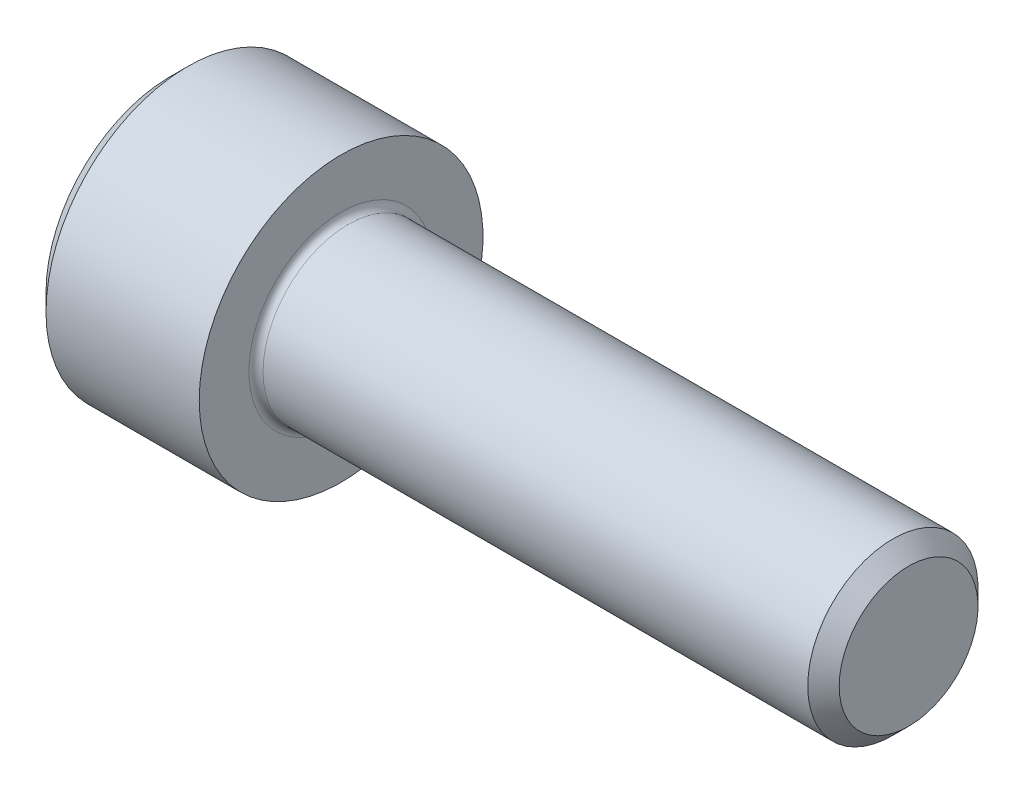
ISO-10303-21;
HEADER;
FILE_DESCRIPTION(('STEP AP214'),'2;1');
FILE_NAME('part.step','',(''),(''),'','','');
FILE_SCHEMA(('AUTOMOTIVE_DESIGN { 1 0 10303 214 1 1 1 1 }'));
ENDSEC;
DATA;
#1=APPLICATION_CONTEXT('core data for automotive mechanical design processes');
#2=APPLICATION_PROTOCOL_DEFINITION('international standard','automotive_design',2000,#1);
#3=PRODUCT_CONTEXT('',#1,'mechanical');
#4=PRODUCT('Part','Part','',(#3));
#5=PRODUCT_RELATED_PRODUCT_CATEGORY('part','',(#4));
#6=PRODUCT_DEFINITION_FORMATION('','',#4);
#7=PRODUCT_DEFINITION_CONTEXT('part definition',#1,'design');
#8=PRODUCT_DEFINITION('design','',#6,#7);
#9=PRODUCT_DEFINITION_SHAPE('','',#8);
#10=(LENGTH_UNIT() NAMED_UNIT(*) SI_UNIT(.MILLI.,.METRE.));
#11=(NAMED_UNIT(*) PLANE_ANGLE_UNIT() SI_UNIT($,.RADIAN.));
#12=(NAMED_UNIT(*) SI_UNIT($,.STERADIAN.) SOLID_ANGLE_UNIT());
#13=UNCERTAINTY_MEASURE_WITH_UNIT(LENGTH_MEASURE(1.E-05),#10,'distance_accuracy_value','');
#14=(GEOMETRIC_REPRESENTATION_CONTEXT(3) GLOBAL_UNCERTAINTY_ASSIGNED_CONTEXT((#13)) GLOBAL_UNIT_ASSIGNED_CONTEXT((#10,
#11,#12)) REPRESENTATION_CONTEXT('',''));
#15=CARTESIAN_POINT('',(0.,0.,0.));
#16=DIRECTION('',(0.,0.,1.));
#17=DIRECTION('',(1.,0.,0.));
#18=AXIS2_PLACEMENT_3D('',#15,#16,#17);
#19=CARTESIAN_POINT('',(0.,0.,0.));
#20=DIRECTION('',(-1.,0.,0.));
#21=DIRECTION('',(0.,0.,1.));
#22=AXIS2_PLACEMENT_3D('',#19,#20,#21);
#23=PLANE('',#22);
#24=DIRECTION('',(0.,-0.499999999999999,0.866025403784439));
#25=VECTOR('',#24,1.);
#26=CARTESIAN_POINT('',(0.,2.93524876856005,0.));
#27=LINE('',#26,#25);
#28=CARTESIAN_POINT('',(0.,2.93524876856005,0.));
#29=VERTEX_POINT('',#28);
#30=CARTESIAN_POINT('',(0.,1.46762438428003,2.542));
#31=VERTEX_POINT('',#30);
#32=EDGE_CURVE('E261',#29,#31,#27,.T.);
#33=ORIENTED_EDGE('',*,*,#32,.T.);
#34=DIRECTION('',(0.,1.,0.));
#35=VECTOR('',#34,1.);
#36=CARTESIAN_POINT('',(0.,-1.46762438428003,2.542));
#37=LINE('',#36,#35);
#38=CARTESIAN_POINT('',(0.,-1.46762438428003,2.542));
#39=VERTEX_POINT('',#38);
#40=EDGE_CURVE('E132',#39,#31,#37,.T.);
#41=ORIENTED_EDGE('',*,*,#40,.F.);
#42=DIRECTION('',(0.,-0.500000000000001,-0.866025403784438));
#43=VECTOR('',#42,1.);
#44=CARTESIAN_POINT('',(0.,-1.46762438428003,2.542));
#45=LINE('',#44,#43);
#46=CARTESIAN_POINT('',(0.,-2.93524876856006,0.));
#47=VERTEX_POINT('',#46);
#48=EDGE_CURVE('E264',#39,#47,#45,.T.);
#49=ORIENTED_EDGE('',*,*,#48,.T.);
#50=DIRECTION('',(0.,0.499999999999999,-0.866025403784439));
#51=VECTOR('',#50,1.);
#52=CARTESIAN_POINT('',(0.,-2.93524876856006,0.));
#53=LINE('',#52,#51);
#54=CARTESIAN_POINT('',(0.,-1.46762438428004,-2.542));
#55=VERTEX_POINT('',#54);
#56=EDGE_CURVE('E267',#47,#55,#53,.T.);
#57=ORIENTED_EDGE('',*,*,#56,.T.);
#58=DIRECTION('',(0.,-1.,0.));
#59=VECTOR('',#58,1.);
#60=CARTESIAN_POINT('',(0.,1.46762438428002,-2.542));
#61=LINE('',#60,#59);
#62=CARTESIAN_POINT('',(0.,1.46762438428002,-2.542));
#63=VERTEX_POINT('',#62);
#64=EDGE_CURVE('E270',#63,#55,#61,.T.);
#65=ORIENTED_EDGE('',*,*,#64,.F.);
#66=DIRECTION('',(0.,-0.500000000000001,-0.866025403784438));
#67=VECTOR('',#66,1.);
#68=CARTESIAN_POINT('',(0.,2.93524876856005,0.));
#69=LINE('',#68,#67);
#70=EDGE_CURVE('E127',#29,#63,#69,.T.);
#71=ORIENTED_EDGE('',*,*,#70,.F.);
#72=EDGE_LOOP('',(#33,#41,#49,#57,#65,#71));
#73=FACE_BOUND('',#72,.T.);
#74=CARTESIAN_POINT('',(0.,0.,0.));
#75=DIRECTION('',(-1.,0.,0.));
#76=DIRECTION('',(0.,0.,1.));
#77=AXIS2_PLACEMENT_3D('',#74,#75,#76);
#78=CIRCLE('',#77,4.4);
#79=CARTESIAN_POINT('',(0.,0.,4.4));
#80=VERTEX_POINT('',#79);
#81=EDGE_CURVE('E156',#80,#80,#78,.T.);
#82=ORIENTED_EDGE('',*,*,#81,.T.);
#83=EDGE_LOOP('',(#82));
#84=FACE_BOUND('',#83,.T.);
#85=ADVANCED_FACE('F36',(#73,#84),#23,.T.);
#86=CARTESIAN_POINT('',(0.,0.,0.));
#87=DIRECTION('',(1.,0.,0.));
#88=DIRECTION('',(0.,0.,-1.));
#89=AXIS2_PLACEMENT_3D('',#86,#87,#88);
#90=CONICAL_SURFACE('',#89,4.4,0.785398163397442);
#91=CARTESIAN_POINT('',(0.600000000000003,0.,0.));
#92=DIRECTION('',(-1.,0.,0.));
#93=DIRECTION('',(0.,0.,1.));
#94=AXIS2_PLACEMENT_3D('',#91,#92,#93);
#95=CIRCLE('',#94,5.);
#96=CARTESIAN_POINT('',(0.600000000000003,0.,5.));
#97=VERTEX_POINT('',#96);
#98=EDGE_CURVE('E153',#97,#97,#95,.T.);
#99=ORIENTED_EDGE('',*,*,#98,.T.);
#100=EDGE_LOOP('',(#99));
#101=FACE_BOUND('',#100,.T.);
#102=ORIENTED_EDGE('',*,*,#81,.F.);
#103=EDGE_LOOP('',(#102));
#104=FACE_BOUND('',#103,.T.);
#105=ADVANCED_FACE('F177',(#101,#104),#90,.T.);
#106=CARTESIAN_POINT('',(-31.75,0.,0.));
#107=DIRECTION('',(-1.,0.,0.));
#108=DIRECTION('',(0.,0.,1.));
#109=AXIS2_PLACEMENT_3D('',#106,#107,#108);
#110=CYLINDRICAL_SURFACE('',#109,5.);
#111=CARTESIAN_POINT('',(6.,0.,0.));
#112=DIRECTION('',(-1.,0.,0.));
#113=DIRECTION('',(0.,0.,1.));
#114=AXIS2_PLACEMENT_3D('',#111,#112,#113);
#115=CIRCLE('',#114,5.);
#116=CARTESIAN_POINT('',(6.,0.,5.));
#117=VERTEX_POINT('',#116);
#118=EDGE_CURVE('E150',#117,#117,#115,.T.);
#119=ORIENTED_EDGE('',*,*,#118,.T.);
#120=EDGE_LOOP('',(#119));
#121=FACE_BOUND('',#120,.T.);
#122=ORIENTED_EDGE('',*,*,#98,.F.);
#123=EDGE_LOOP('',(#122));
#124=FACE_BOUND('',#123,.T.);
#125=ADVANCED_FACE('F182',(#121,#124),#110,.T.);
#126=CARTESIAN_POINT('',(6.,5.,0.));
#127=DIRECTION('',(1.,0.,0.));
#128=DIRECTION('',(0.,0.,-1.));
#129=AXIS2_PLACEMENT_3D('',#126,#127,#128);
#130=PLANE('',#129);
#131=CARTESIAN_POINT('',(6.,0.,0.));
#132=DIRECTION('',(1.,0.,0.));
#133=DIRECTION('',(0.,0.,-1.));
#134=AXIS2_PLACEMENT_3D('',#131,#132,#133);
#135=CIRCLE('',#134,3.24999999999998);
#136=CARTESIAN_POINT('',(6.,0.,-3.24999999999998));
#137=VERTEX_POINT('',#136);
#138=EDGE_CURVE('E44',#137,#137,#135,.F.);
#139=ORIENTED_EDGE('',*,*,#138,.T.);
#140=EDGE_LOOP('',(#139));
#141=FACE_BOUND('',#140,.T.);
#142=ORIENTED_EDGE('',*,*,#118,.F.);
#143=EDGE_LOOP('',(#142));
#144=FACE_BOUND('',#143,.T.);
#145=ADVANCED_FACE('F161',(#141,#144),#130,.T.);
#146=CARTESIAN_POINT('',(-31.75,0.,0.));
#147=DIRECTION('',(-1.,0.,0.));
#148=DIRECTION('',(0.,0.,1.));
#149=AXIS2_PLACEMENT_3D('',#146,#147,#148);
#150=CYLINDRICAL_SURFACE('',#149,2.99999999999998);
#151=CARTESIAN_POINT('',(6.25,0.,0.));
#152=DIRECTION('',(1.,0.,0.));
#153=DIRECTION('',(0.,0.,-1.));
#154=AXIS2_PLACEMENT_3D('',#151,#152,#153);
#155=CIRCLE('',#154,2.99999999999998);
#156=CARTESIAN_POINT('',(6.25,0.,-2.99999999999998));
#157=VERTEX_POINT('',#156);
#158=EDGE_CURVE('E11',#157,#157,#155,.T.);
#159=ORIENTED_EDGE('',*,*,#158,.T.);
#160=EDGE_LOOP('',(#159));
#161=FACE_BOUND('',#160,.T.);
#162=CARTESIAN_POINT('',(25.4455,0.,0.));
#163=DIRECTION('',(-1.,0.,0.));
#164=DIRECTION('',(0.,0.,1.));
#165=AXIS2_PLACEMENT_3D('',#162,#163,#164);
#166=CIRCLE('',#165,2.99999999999995);
#167=CARTESIAN_POINT('',(25.4455,0.,2.99999999999995));
#168=VERTEX_POINT('',#167);
#169=EDGE_CURVE('E147',#168,#168,#166,.T.);
#170=ORIENTED_EDGE('',*,*,#169,.T.);
#171=EDGE_LOOP('',(#170));
#172=FACE_BOUND('',#171,.T.);
#173=ADVANCED_FACE('F192',(#161,#172),#150,.T.);
#174=CARTESIAN_POINT('',(26.,0.,0.));
#175=DIRECTION('',(-1.,0.,0.));
#176=DIRECTION('',(0.,0.,1.));
#177=AXIS2_PLACEMENT_3D('',#174,#175,#176);
#178=CONICAL_SURFACE('',#177,2.4455,0.785398163397388);
#179=ORIENTED_EDGE('',*,*,#169,.F.);
#180=EDGE_LOOP('',(#179));
#181=FACE_BOUND('',#180,.T.);
#182=CARTESIAN_POINT('',(26.,0.,0.));
#183=DIRECTION('',(-1.,0.,0.));
#184=DIRECTION('',(0.,0.,1.));
#185=AXIS2_PLACEMENT_3D('',#182,#183,#184);
#186=CIRCLE('',#185,2.4455);
#187=CARTESIAN_POINT('',(26.,0.,2.4455));
#188=VERTEX_POINT('',#187);
#189=EDGE_CURVE('E143',#188,#188,#186,.T.);
#190=ORIENTED_EDGE('',*,*,#189,.T.);
#191=EDGE_LOOP('',(#190));
#192=FACE_BOUND('',#191,.T.);
#193=ADVANCED_FACE('F172',(#181,#192),#178,.T.);
#194=CARTESIAN_POINT('',(26.,2.4455,0.));
#195=DIRECTION('',(1.,0.,0.));
#196=DIRECTION('',(0.,0.,-1.));
#197=AXIS2_PLACEMENT_3D('',#194,#195,#196);
#198=PLANE('',#197);
#199=ORIENTED_EDGE('',*,*,#189,.F.);
#200=EDGE_LOOP('',(#199));
#201=FACE_BOUND('',#200,.T.);
#202=ADVANCED_FACE('F165',(#201),#198,.T.);
#203=CARTESIAN_POINT('',(6.25,0.,0.));
#204=DIRECTION('',(1.,0.,0.));
#205=DIRECTION('',(0.,0.,-1.));
#206=AXIS2_PLACEMENT_3D('',#203,#204,#205);
#207=TOROIDAL_SURFACE('',#206,3.24999999999998,0.25);
#208=ORIENTED_EDGE('',*,*,#158,.F.);
#209=EDGE_LOOP('',(#208));
#210=FACE_BOUND('',#209,.T.);
#211=ORIENTED_EDGE('',*,*,#138,.F.);
#212=EDGE_LOOP('',(#211));
#213=FACE_BOUND('',#212,.T.);
#214=ADVANCED_FACE('F38',(#210,#213),#207,.F.);
#215=CARTESIAN_POINT('',(3.,2.93524876856005,0.));
#216=DIRECTION('',(0.,-0.866025403784439,-0.499999999999999));
#217=DIRECTION('',(0.,0.499999999999999,-0.866025403784439));
#218=AXIS2_PLACEMENT_3D('',#215,#216,#217);
#219=PLANE('',#218);
#220=ORIENTED_EDGE('',*,*,#32,.F.);
#221=DIRECTION('',(-1.,0.,0.));
#222=VECTOR('',#221,1.);
#223=CARTESIAN_POINT('',(3.,2.93524876856005,0.));
#224=LINE('',#223,#222);
#225=CARTESIAN_POINT('',(3.,2.93524876856005,0.));
#226=VERTEX_POINT('',#225);
#227=EDGE_CURVE('E251',#226,#29,#224,.T.);
#228=ORIENTED_EDGE('',*,*,#227,.F.);
#229=DIRECTION('',(0.,-0.499999999999999,0.866025403784439));
#230=VECTOR('',#229,1.);
#231=CARTESIAN_POINT('',(3.,2.93524876856005,0.));
#232=LINE('',#231,#230);
#233=CARTESIAN_POINT('',(3.,2.20143657642004,1.271));
#234=VERTEX_POINT('',#233);
#235=EDGE_CURVE('E119',#226,#234,#232,.T.);
#236=ORIENTED_EDGE('',*,*,#235,.T.);
#237=CARTESIAN_POINT('',(3.,1.46762438428003,2.542));
#238=VERTEX_POINT('',#237);
#239=EDGE_CURVE('E110',#234,#238,#232,.T.);
#240=ORIENTED_EDGE('',*,*,#239,.T.);
#241=DIRECTION('',(-1.,0.,0.));
#242=VECTOR('',#241,1.);
#243=CARTESIAN_POINT('',(3.,1.46762438428003,2.542));
#244=LINE('',#243,#242);
#245=EDGE_CURVE('E124',#238,#31,#244,.T.);
#246=ORIENTED_EDGE('',*,*,#245,.T.);
#247=EDGE_LOOP('',(#220,#228,#236,#240,#246));
#248=FACE_BOUND('',#247,.T.);
#249=ADVANCED_FACE('F123',(#248),#219,.T.);
#250=CARTESIAN_POINT('',(3.,-1.46762438428003,2.542));
#251=DIRECTION('',(0.,0.,1.));
#252=DIRECTION('',(0.,-1.,0.));
#253=AXIS2_PLACEMENT_3D('',#250,#251,#252);
#254=PLANE('',#253);
#255=ORIENTED_EDGE('',*,*,#40,.T.);
#256=ORIENTED_EDGE('',*,*,#245,.F.);
#257=DIRECTION('',(0.,1.,0.));
#258=VECTOR('',#257,1.);
#259=CARTESIAN_POINT('',(3.,-1.46762438428003,2.542));
#260=LINE('',#259,#258);
#261=CARTESIAN_POINT('',(3.,0.,2.542));
#262=VERTEX_POINT('',#261);
#263=EDGE_CURVE('E107',#262,#238,#260,.T.);
#264=ORIENTED_EDGE('',*,*,#263,.F.);
#265=CARTESIAN_POINT('',(3.,-1.46762438428003,2.542));
#266=VERTEX_POINT('',#265);
#267=EDGE_CURVE('E118',#266,#262,#260,.T.);
#268=ORIENTED_EDGE('',*,*,#267,.F.);
#269=DIRECTION('',(-1.,0.,0.));
#270=VECTOR('',#269,1.);
#271=CARTESIAN_POINT('',(3.,-1.46762438428003,2.542));
#272=LINE('',#271,#270);
#273=EDGE_CURVE('E134',#266,#39,#272,.T.);
#274=ORIENTED_EDGE('',*,*,#273,.T.);
#275=EDGE_LOOP('',(#255,#256,#264,#268,#274));
#276=FACE_BOUND('',#275,.T.);
#277=ADVANCED_FACE('F129',(#276),#254,.F.);
#278=CARTESIAN_POINT('',(3.,-1.46762438428003,2.542));
#279=DIRECTION('',(0.,0.866025403784438,-0.500000000000001));
#280=DIRECTION('',(0.,0.500000000000001,0.866025403784438));
#281=AXIS2_PLACEMENT_3D('',#278,#279,#280);
#282=PLANE('',#281);
#283=ORIENTED_EDGE('',*,*,#48,.F.);
#284=ORIENTED_EDGE('',*,*,#273,.F.);
#285=DIRECTION('',(0.,-0.500000000000001,-0.866025403784438));
#286=VECTOR('',#285,1.);
#287=CARTESIAN_POINT('',(3.,-1.46762438428003,2.542));
#288=LINE('',#287,#286);
#289=CARTESIAN_POINT('',(3.,-2.20143657642004,1.271));
#290=VERTEX_POINT('',#289);
#291=EDGE_CURVE('E290',#266,#290,#288,.T.);
#292=ORIENTED_EDGE('',*,*,#291,.T.);
#293=CARTESIAN_POINT('',(3.,-2.93524876856006,0.));
#294=VERTEX_POINT('',#293);
#295=EDGE_CURVE('E279',#290,#294,#288,.T.);
#296=ORIENTED_EDGE('',*,*,#295,.T.);
#297=DIRECTION('',(-1.,0.,0.));
#298=VECTOR('',#297,1.);
#299=CARTESIAN_POINT('',(3.,-2.93524876856006,0.));
#300=LINE('',#299,#298);
#301=EDGE_CURVE('E139',#294,#47,#300,.T.);
#302=ORIENTED_EDGE('',*,*,#301,.T.);
#303=EDGE_LOOP('',(#283,#284,#292,#296,#302));
#304=FACE_BOUND('',#303,.T.);
#305=ADVANCED_FACE('F205',(#304),#282,.T.);
#306=CARTESIAN_POINT('',(3.,-2.93524876856006,0.));
#307=DIRECTION('',(0.,0.866025403784439,0.499999999999999));
#308=DIRECTION('',(0.,-0.499999999999999,0.866025403784439));
#309=AXIS2_PLACEMENT_3D('',#306,#307,#308);
#310=PLANE('',#309);
#311=ORIENTED_EDGE('',*,*,#56,.F.);
#312=ORIENTED_EDGE('',*,*,#301,.F.);
#313=DIRECTION('',(0.,0.499999999999999,-0.866025403784439));
#314=VECTOR('',#313,1.);
#315=CARTESIAN_POINT('',(3.,-2.93524876856006,0.));
#316=LINE('',#315,#314);
#317=CARTESIAN_POINT('',(3.,-2.20143657642005,-1.271));
#318=VERTEX_POINT('',#317);
#319=EDGE_CURVE('E257',#294,#318,#316,.T.);
#320=ORIENTED_EDGE('',*,*,#319,.T.);
#321=CARTESIAN_POINT('',(3.,-1.46762438428004,-2.542));
#322=VERTEX_POINT('',#321);
#323=EDGE_CURVE('E289',#318,#322,#316,.T.);
#324=ORIENTED_EDGE('',*,*,#323,.T.);
#325=DIRECTION('',(-1.,0.,0.));
#326=VECTOR('',#325,1.);
#327=CARTESIAN_POINT('',(3.,-1.46762438428004,-2.542));
#328=LINE('',#327,#326);
#329=EDGE_CURVE('E250',#322,#55,#328,.T.);
#330=ORIENTED_EDGE('',*,*,#329,.T.);
#331=EDGE_LOOP('',(#311,#312,#320,#324,#330));
#332=FACE_BOUND('',#331,.T.);
#333=ADVANCED_FACE('F208',(#332),#310,.T.);
#334=CARTESIAN_POINT('',(3.,1.46762438428002,-2.542));
#335=DIRECTION('',(0.,0.,-1.));
#336=DIRECTION('',(0.,1.,0.));
#337=AXIS2_PLACEMENT_3D('',#334,#335,#336);
#338=PLANE('',#337);
#339=ORIENTED_EDGE('',*,*,#64,.T.);
#340=ORIENTED_EDGE('',*,*,#329,.F.);
#341=DIRECTION('',(0.,-1.,0.));
#342=VECTOR('',#341,1.);
#343=CARTESIAN_POINT('',(3.,1.46762438428002,-2.542));
#344=LINE('',#343,#342);
#345=CARTESIAN_POINT('',(3.,0.,-2.542));
#346=VERTEX_POINT('',#345);
#347=EDGE_CURVE('E254',#346,#322,#344,.T.);
#348=ORIENTED_EDGE('',*,*,#347,.F.);
#349=CARTESIAN_POINT('',(3.,1.46762438428002,-2.542));
#350=VERTEX_POINT('',#349);
#351=EDGE_CURVE('E51',#350,#346,#344,.T.);
#352=ORIENTED_EDGE('',*,*,#351,.F.);
#353=DIRECTION('',(-1.,0.,0.));
#354=VECTOR('',#353,1.);
#355=CARTESIAN_POINT('',(3.,1.46762438428002,-2.542));
#356=LINE('',#355,#354);
#357=EDGE_CURVE('E247',#350,#63,#356,.T.);
#358=ORIENTED_EDGE('',*,*,#357,.T.);
#359=EDGE_LOOP('',(#339,#340,#348,#352,#358));
#360=FACE_BOUND('',#359,.T.);
#361=ADVANCED_FACE('F212',(#360),#338,.F.);
#362=CARTESIAN_POINT('',(3.,2.93524876856005,0.));
#363=DIRECTION('',(0.,0.866025403784438,-0.500000000000001));
#364=DIRECTION('',(0.,0.500000000000001,0.866025403784438));
#365=AXIS2_PLACEMENT_3D('',#362,#363,#364);
#366=PLANE('',#365);
#367=ORIENTED_EDGE('',*,*,#70,.T.);
#368=ORIENTED_EDGE('',*,*,#357,.F.);
#369=DIRECTION('',(0.,-0.500000000000001,-0.866025403784438));
#370=VECTOR('',#369,1.);
#371=CARTESIAN_POINT('',(3.,2.93524876856005,0.));
#372=LINE('',#371,#370);
#373=CARTESIAN_POINT('',(3.,2.20143657642004,-1.271));
#374=VERTEX_POINT('',#373);
#375=EDGE_CURVE('E237',#374,#350,#372,.T.);
#376=ORIENTED_EDGE('',*,*,#375,.F.);
#377=EDGE_CURVE('E243',#226,#374,#372,.T.);
#378=ORIENTED_EDGE('',*,*,#377,.F.);
#379=ORIENTED_EDGE('',*,*,#227,.T.);
#380=EDGE_LOOP('',(#367,#368,#376,#378,#379));
#381=FACE_BOUND('',#380,.T.);
#382=ADVANCED_FACE('F216',(#381),#366,.F.);
#383=CARTESIAN_POINT('',(3.,2.93524876856005,0.));
#384=DIRECTION('',(1.,0.,0.));
#385=DIRECTION('',(0.,0.,-1.));
#386=AXIS2_PLACEMENT_3D('',#383,#384,#385);
#387=PLANE('',#386);
#388=ORIENTED_EDGE('',*,*,#347,.T.);
#389=ORIENTED_EDGE('',*,*,#323,.F.);
#390=CARTESIAN_POINT('',(3.,0.,0.));
#391=DIRECTION('',(-1.,0.,0.));
#392=DIRECTION('',(0.,0.,1.));
#393=AXIS2_PLACEMENT_3D('',#390,#391,#392);
#394=CIRCLE('',#393,2.542);
#395=EDGE_CURVE('E285',#346,#318,#394,.T.);
#396=ORIENTED_EDGE('',*,*,#395,.F.);
#397=EDGE_LOOP('',(#388,#389,#396));
#398=FACE_BOUND('',#397,.T.);
#399=ADVANCED_FACE('F220',(#398),#387,.F.);
#400=ORIENTED_EDGE('',*,*,#319,.F.);
#401=ORIENTED_EDGE('',*,*,#295,.F.);
#402=EDGE_CURVE('E137',#318,#290,#394,.T.);
#403=ORIENTED_EDGE('',*,*,#402,.F.);
#404=EDGE_LOOP('',(#400,#401,#403));
#405=FACE_BOUND('',#404,.T.);
#406=ADVANCED_FACE('F223',(#405),#387,.F.);
#407=ORIENTED_EDGE('',*,*,#291,.F.);
#408=ORIENTED_EDGE('',*,*,#267,.T.);
#409=EDGE_CURVE('E133',#290,#262,#394,.T.);
#410=ORIENTED_EDGE('',*,*,#409,.F.);
#411=EDGE_LOOP('',(#407,#408,#410));
#412=FACE_BOUND('',#411,.T.);
#413=ADVANCED_FACE('F228',(#412),#387,.F.);
#414=ORIENTED_EDGE('',*,*,#263,.T.);
#415=ORIENTED_EDGE('',*,*,#239,.F.);
#416=EDGE_CURVE('E113',#262,#234,#394,.T.);
#417=ORIENTED_EDGE('',*,*,#416,.F.);
#418=EDGE_LOOP('',(#414,#415,#417));
#419=FACE_BOUND('',#418,.T.);
#420=ADVANCED_FACE('F109',(#419),#387,.F.);
#421=ORIENTED_EDGE('',*,*,#235,.F.);
#422=ORIENTED_EDGE('',*,*,#377,.T.);
#423=EDGE_CURVE('E144',#234,#374,#394,.T.);
#424=ORIENTED_EDGE('',*,*,#423,.F.);
#425=EDGE_LOOP('',(#421,#422,#424));
#426=FACE_BOUND('',#425,.T.);
#427=ADVANCED_FACE('F231',(#426),#387,.F.);
#428=ORIENTED_EDGE('',*,*,#375,.T.);
#429=ORIENTED_EDGE('',*,*,#351,.T.);
#430=EDGE_CURVE('E240',#374,#346,#394,.T.);
#431=ORIENTED_EDGE('',*,*,#430,.F.);
#432=EDGE_LOOP('',(#428,#429,#431));
#433=FACE_BOUND('',#432,.T.);
#434=ADVANCED_FACE('F201',(#433),#387,.F.);
#435=CARTESIAN_POINT('',(3.,0.,0.));
#436=DIRECTION('',(-1.,0.,0.));
#437=DIRECTION('',(0.,0.,1.));
#438=AXIS2_PLACEMENT_3D('',#435,#436,#437);
#439=CONICAL_SURFACE('',#438,2.542,1.04719755119659);
#440=CARTESIAN_POINT('',(4.46762438428004,0.,0.));
#441=VERTEX_POINT('',#440);
#442=VERTEX_LOOP('',#441);
#443=FACE_BOUND('',#442,.T.);
#444=ORIENTED_EDGE('',*,*,#416,.T.);
#445=ORIENTED_EDGE('',*,*,#423,.T.);
#446=ORIENTED_EDGE('',*,*,#430,.T.);
#447=ORIENTED_EDGE('',*,*,#395,.T.);
#448=ORIENTED_EDGE('',*,*,#402,.T.);
#449=ORIENTED_EDGE('',*,*,#409,.T.);
#450=EDGE_LOOP('',(#444,#445,#446,#447,#448,#449));
#451=FACE_BOUND('',#450,.T.);
#452=ADVANCED_FACE('F199',(#443,#451),#439,.F.);
#453=CLOSED_SHELL('',(#85,#105,#125,#145,#173,#193,#202,#214,#249,#277,#305,#333,#361,#382,#399,
#406,#413,#420,#427,#434,#452));
#454=MANIFOLD_SOLID_BREP('B2',#453);
#455=ADVANCED_BREP_SHAPE_REPRESENTATION('',(#18,#454),#14);
#456=SHAPE_DEFINITION_REPRESENTATION(#9,#455);
ENDSEC;
END-ISO-10303-21;
